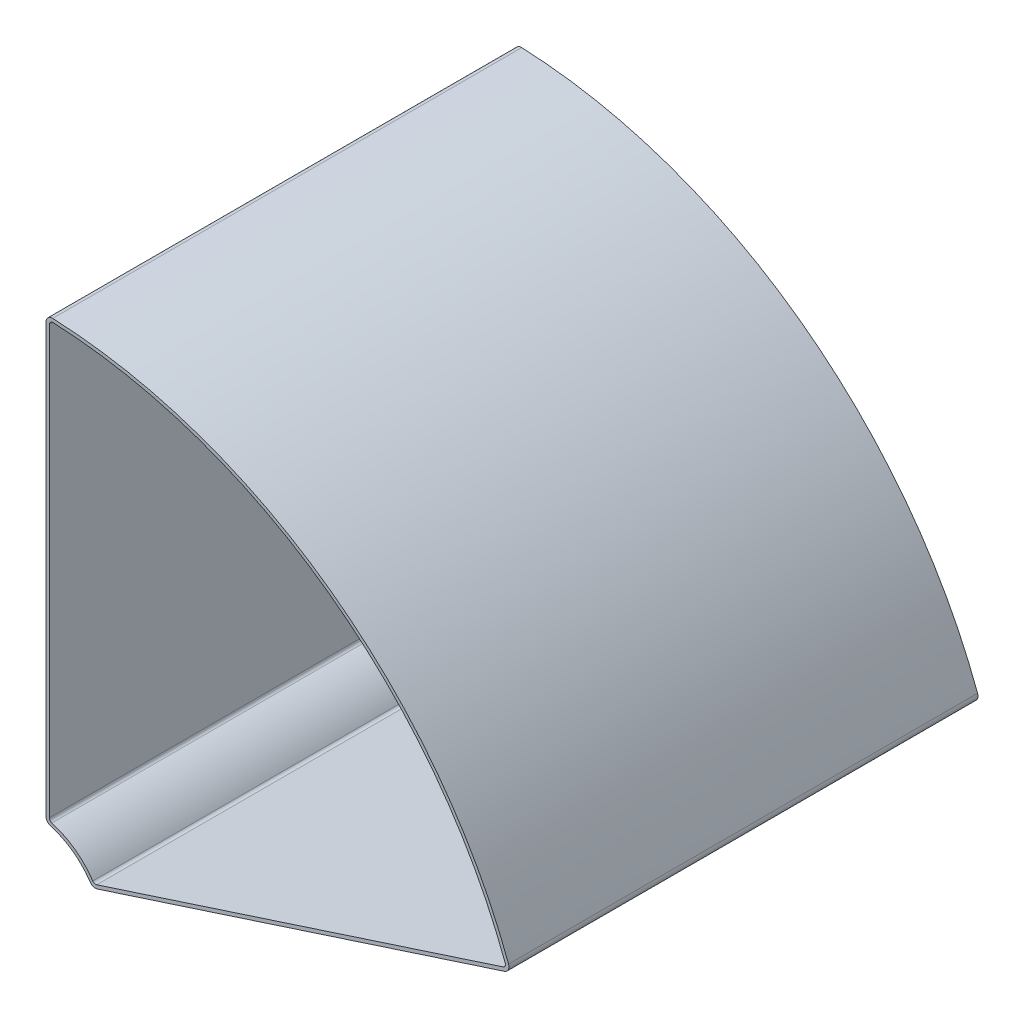
ISO-10303-21;
HEADER;
FILE_DESCRIPTION(('STEP AP214'),'2;1');
FILE_NAME('part.step','',(''),(''),'','','');
FILE_SCHEMA(('AUTOMOTIVE_DESIGN { 1 0 10303 214 1 1 1 1 }'));
ENDSEC;
DATA;
#1=APPLICATION_CONTEXT('core data for automotive mechanical design processes');
#2=APPLICATION_PROTOCOL_DEFINITION('international standard','automotive_design',2000,#1);
#3=PRODUCT_CONTEXT('',#1,'mechanical');
#4=PRODUCT('Part','Part','',(#3));
#5=PRODUCT_RELATED_PRODUCT_CATEGORY('part','',(#4));
#6=PRODUCT_DEFINITION_FORMATION('','',#4);
#7=PRODUCT_DEFINITION_CONTEXT('part definition',#1,'design');
#8=PRODUCT_DEFINITION('design','',#6,#7);
#9=PRODUCT_DEFINITION_SHAPE('','',#8);
#10=(LENGTH_UNIT() NAMED_UNIT(*) SI_UNIT(.MILLI.,.METRE.));
#11=(NAMED_UNIT(*) PLANE_ANGLE_UNIT() SI_UNIT($,.RADIAN.));
#12=(NAMED_UNIT(*) SI_UNIT($,.STERADIAN.) SOLID_ANGLE_UNIT());
#13=UNCERTAINTY_MEASURE_WITH_UNIT(LENGTH_MEASURE(1.E-05),#10,'distance_accuracy_value','');
#14=(GEOMETRIC_REPRESENTATION_CONTEXT(3) GLOBAL_UNCERTAINTY_ASSIGNED_CONTEXT((#13)) GLOBAL_UNIT_ASSIGNED_CONTEXT((#10,
#11,#12)) REPRESENTATION_CONTEXT('',''));
#15=CARTESIAN_POINT('',(0.,0.,0.));
#16=DIRECTION('',(0.,0.,1.));
#17=DIRECTION('',(1.,0.,0.));
#18=AXIS2_PLACEMENT_3D('',#15,#16,#17);
#19=CARTESIAN_POINT('',(-2.65754615162452,8.17908604013824,220.));
#20=DIRECTION('',(0.309016994374948,-0.951056516295153,0.));
#21=DIRECTION('',(0.951056516295154,0.309016994374948,0.));
#22=AXIS2_PLACEMENT_3D('',#19,#20,#21);
#23=PLANE('',#22);
#24=DIRECTION('',(-0.951056516295154,-0.309016994374948,0.));
#25=VECTOR('',#24,1.);
#26=CARTESIAN_POINT('',(-2.65754615162452,8.17908604013824,1.6));
#27=LINE('',#26,#25);
#28=CARTESIAN_POINT('',(221.391668918439,80.9770889419244,1.6));
#29=VERTEX_POINT('',#28);
#30=CARTESIAN_POINT('',(30.7720565747776,19.0410224031876,1.6));
#31=VERTEX_POINT('',#30);
#32=EDGE_CURVE('E563',#29,#31,#27,.T.);
#33=ORIENTED_EDGE('',*,*,#32,.T.);
#34=DIRECTION('',(0.,0.,1.));
#35=VECTOR('',#34,1.);
#36=CARTESIAN_POINT('',(30.7720565747776,19.0410224031876,220.));
#37=LINE('',#36,#35);
#38=CARTESIAN_POINT('',(30.7720565747776,19.0410224031876,220.));
#39=VERTEX_POINT('',#38);
#40=EDGE_CURVE('E159',#31,#39,#37,.T.);
#41=ORIENTED_EDGE('',*,*,#40,.T.);
#42=DIRECTION('',(-0.951056516295154,-0.309016994374948,0.));
#43=VECTOR('',#42,1.);
#44=CARTESIAN_POINT('',(-2.65754615162452,8.17908604013824,220.));
#45=LINE('',#44,#43);
#46=CARTESIAN_POINT('',(221.391668918439,80.9770889419244,220.));
#47=VERTEX_POINT('',#46);
#48=EDGE_CURVE('E201',#47,#39,#45,.T.);
#49=ORIENTED_EDGE('',*,*,#48,.F.);
#50=DIRECTION('',(0.,0.,-1.));
#51=VECTOR('',#50,1.);
#52=CARTESIAN_POINT('',(221.391668918439,80.9770889419244,220.));
#53=LINE('',#52,#51);
#54=EDGE_CURVE('E164',#47,#29,#53,.T.);
#55=ORIENTED_EDGE('',*,*,#54,.T.);
#56=EDGE_LOOP('',(#33,#41,#49,#55));
#57=FACE_BOUND('',#56,.T.);
#58=ADVANCED_FACE('F39',(#57),#23,.F.);
#59=CARTESIAN_POINT('',(0.,0.,220.));
#60=DIRECTION('',(0.,0.,-1.));
#61=DIRECTION('',(-1.,0.,0.));
#62=AXIS2_PLACEMENT_3D('',#59,#60,#61);
#63=CYLINDRICAL_SURFACE('',#62,35.);
#64=CARTESIAN_POINT('',(0.,0.,220.));
#65=DIRECTION('',(0.,0.,1.));
#66=DIRECTION('',(1.,0.,0.));
#67=AXIS2_PLACEMENT_3D('',#64,#65,#66);
#68=CIRCLE('',#67,35.);
#69=CARTESIAN_POINT('',(28.9540171702792,19.6637964214233,220.));
#70=VERTEX_POINT('',#69);
#71=CARTESIAN_POINT('',(9.75409836065576,33.6133539708648,220.));
#72=VERTEX_POINT('',#71);
#73=EDGE_CURVE('E174',#70,#72,#68,.T.);
#74=ORIENTED_EDGE('',*,*,#73,.F.);
#75=DIRECTION('',(0.,0.,-1.));
#76=VECTOR('',#75,1.);
#77=CARTESIAN_POINT('',(28.9540171702792,19.6637964214233,220.));
#78=LINE('',#77,#76);
#79=CARTESIAN_POINT('',(28.9540171702792,19.6637964214233,1.6));
#80=VERTEX_POINT('',#79);
#81=EDGE_CURVE('E158',#70,#80,#78,.T.);
#82=ORIENTED_EDGE('',*,*,#81,.T.);
#83=CARTESIAN_POINT('',(0.,0.,1.6));
#84=DIRECTION('',(0.,0.,1.));
#85=DIRECTION('',(1.,0.,0.));
#86=AXIS2_PLACEMENT_3D('',#83,#84,#85);
#87=CIRCLE('',#86,35.);
#88=CARTESIAN_POINT('',(9.75409836065576,33.6133539708648,1.6));
#89=VERTEX_POINT('',#88);
#90=EDGE_CURVE('E171',#80,#89,#87,.T.);
#91=ORIENTED_EDGE('',*,*,#90,.T.);
#92=DIRECTION('',(0.,0.,-1.));
#93=VECTOR('',#92,1.);
#94=CARTESIAN_POINT('',(9.75409836065576,33.6133539708648,220.));
#95=LINE('',#94,#93);
#96=EDGE_CURVE('E176',#89,#72,#95,.F.);
#97=ORIENTED_EDGE('',*,*,#96,.T.);
#98=EDGE_LOOP('',(#74,#82,#91,#97));
#99=FACE_BOUND('',#98,.T.);
#100=ADVANCED_FACE('F170',(#99),#63,.T.);
#101=CARTESIAN_POINT('',(8.60000000000003,0.,220.));
#102=DIRECTION('',(1.,0.,0.));
#103=DIRECTION('',(0.,1.,0.));
#104=AXIS2_PLACEMENT_3D('',#101,#102,#103);
#105=PLANE('',#104);
#106=DIRECTION('',(0.,-1.,0.));
#107=VECTOR('',#106,1.);
#108=CARTESIAN_POINT('',(8.60000000000003,0.,220.));
#109=LINE('',#108,#107);
#110=CARTESIAN_POINT('',(8.6,235.579286016407,220.));
#111=VERTEX_POINT('',#110);
#112=CARTESIAN_POINT('',(8.60000000000002,35.1499644381043,220.));
#113=VERTEX_POINT('',#112);
#114=EDGE_CURVE('E205',#111,#113,#109,.T.);
#115=ORIENTED_EDGE('',*,*,#114,.T.);
#116=DIRECTION('',(0.,0.,-1.));
#117=VECTOR('',#116,1.);
#118=CARTESIAN_POINT('',(8.60000000000002,35.1499644381043,220.));
#119=LINE('',#118,#117);
#120=CARTESIAN_POINT('',(8.60000000000002,35.1499644381043,1.6));
#121=VERTEX_POINT('',#120);
#122=EDGE_CURVE('E227',#113,#121,#119,.T.);
#123=ORIENTED_EDGE('',*,*,#122,.T.);
#124=DIRECTION('',(0.,-1.,0.));
#125=VECTOR('',#124,1.);
#126=CARTESIAN_POINT('',(8.60000000000003,0.,1.6));
#127=LINE('',#126,#125);
#128=CARTESIAN_POINT('',(8.6,235.579286016407,1.6));
#129=VERTEX_POINT('',#128);
#130=EDGE_CURVE('E181',#129,#121,#127,.T.);
#131=ORIENTED_EDGE('',*,*,#130,.F.);
#132=DIRECTION('',(0.,0.,1.));
#133=VECTOR('',#132,1.);
#134=CARTESIAN_POINT('',(8.6,235.579286016407,220.));
#135=LINE('',#134,#133);
#136=EDGE_CURVE('E225',#129,#111,#135,.T.);
#137=ORIENTED_EDGE('',*,*,#136,.T.);
#138=EDGE_LOOP('',(#115,#123,#131,#137));
#139=FACE_BOUND('',#138,.T.);
#140=ADVANCED_FACE('F318',(#139),#105,.T.);
#141=CARTESIAN_POINT('',(0.,0.,220.));
#142=DIRECTION('',(0.,0.,-1.));
#143=DIRECTION('',(-1.,0.,0.));
#144=AXIS2_PLACEMENT_3D('',#141,#142,#143);
#145=CYLINDRICAL_SURFACE('',#144,33.4);
#146=CARTESIAN_POINT('',(0.,0.,0.));
#147=DIRECTION('',(0.,0.,1.));
#148=DIRECTION('',(1.,0.,0.));
#149=AXIS2_PLACEMENT_3D('',#146,#147,#148);
#150=CIRCLE('',#149,33.4);
#151=CARTESIAN_POINT('',(27.707561529854,18.6507649727661,0.));
#152=VERTEX_POINT('',#151);
#153=CARTESIAN_POINT('',(9.17582417582418,32.1148602782942,0.));
#154=VERTEX_POINT('',#153);
#155=EDGE_CURVE('E180',#152,#154,#150,.T.);
#156=ORIENTED_EDGE('',*,*,#155,.F.);
#157=DIRECTION('',(0.,0.,-1.));
#158=VECTOR('',#157,1.);
#159=CARTESIAN_POINT('',(27.707561529854,18.6507649727661,220.));
#160=LINE('',#159,#158);
#161=CARTESIAN_POINT('',(27.707561529854,18.6507649727661,220.));
#162=VERTEX_POINT('',#161);
#163=EDGE_CURVE('E259',#152,#162,#160,.F.);
#164=ORIENTED_EDGE('',*,*,#163,.T.);
#165=CARTESIAN_POINT('',(0.,0.,220.));
#166=DIRECTION('',(0.,0.,1.));
#167=DIRECTION('',(1.,0.,0.));
#168=AXIS2_PLACEMENT_3D('',#165,#166,#167);
#169=CIRCLE('',#168,33.4);
#170=CARTESIAN_POINT('',(9.17582417582418,32.1148602782942,220.));
#171=VERTEX_POINT('',#170);
#172=EDGE_CURVE('E190',#162,#171,#169,.T.);
#173=ORIENTED_EDGE('',*,*,#172,.T.);
#174=DIRECTION('',(0.,0.,-1.));
#175=VECTOR('',#174,1.);
#176=CARTESIAN_POINT('',(9.17582417582418,32.1148602782942,220.));
#177=LINE('',#176,#175);
#178=EDGE_CURVE('E256',#171,#154,#177,.T.);
#179=ORIENTED_EDGE('',*,*,#178,.T.);
#180=EDGE_LOOP('',(#156,#164,#173,#179));
#181=FACE_BOUND('',#180,.T.);
#182=ADVANCED_FACE('F294',(#181),#145,.F.);
#183=CARTESIAN_POINT('',(-2.16311896062463,6.65739561406607,220.));
#184=DIRECTION('',(0.309016994374948,-0.951056516295154,0.));
#185=DIRECTION('',(0.951056516295154,0.309016994374948,0.));
#186=AXIS2_PLACEMENT_3D('',#183,#184,#185);
#187=PLANE('',#186);
#188=DIRECTION('',(-0.951056516295154,-0.309016994374948,0.));
#189=VECTOR('',#188,1.);
#190=CARTESIAN_POINT('',(-2.16311896062463,6.65739561406607,220.));
#191=LINE('',#190,#189);
#192=CARTESIAN_POINT('',(222.084633334989,79.5199071708688,220.));
#193=VERTEX_POINT('',#192);
#194=CARTESIAN_POINT('',(31.1233156444028,17.4728138346081,220.));
#195=VERTEX_POINT('',#194);
#196=EDGE_CURVE('E193',#193,#195,#191,.T.);
#197=ORIENTED_EDGE('',*,*,#196,.T.);
#198=DIRECTION('',(0.,0.,-1.));
#199=VECTOR('',#198,1.);
#200=CARTESIAN_POINT('',(31.1233156444028,17.4728138346081,220.));
#201=LINE('',#200,#199);
#202=CARTESIAN_POINT('',(31.1233156444028,17.4728138346081,0.));
#203=VERTEX_POINT('',#202);
#204=EDGE_CURVE('E245',#195,#203,#201,.T.);
#205=ORIENTED_EDGE('',*,*,#204,.T.);
#206=DIRECTION('',(-0.951056516295154,-0.309016994374948,0.));
#207=VECTOR('',#206,1.);
#208=CARTESIAN_POINT('',(-2.16311896062463,6.65739561406607,0.));
#209=LINE('',#208,#207);
#210=CARTESIAN_POINT('',(222.084633334989,79.5199071708688,0.));
#211=VERTEX_POINT('',#210);
#212=EDGE_CURVE('E184',#211,#203,#209,.T.);
#213=ORIENTED_EDGE('',*,*,#212,.F.);
#214=DIRECTION('',(0.,0.,1.));
#215=VECTOR('',#214,1.);
#216=CARTESIAN_POINT('',(222.084633334989,79.5199071708688,220.));
#217=LINE('',#216,#215);
#218=EDGE_CURVE('E243',#211,#193,#217,.T.);
#219=ORIENTED_EDGE('',*,*,#218,.T.);
#220=EDGE_LOOP('',(#197,#205,#213,#219));
#221=FACE_BOUND('',#220,.T.);
#222=ADVANCED_FACE('F302',(#221),#187,.T.);
#223=CARTESIAN_POINT('',(0.,0.,220.));
#224=DIRECTION('',(0.,0.,-1.));
#225=DIRECTION('',(-1.,0.,0.));
#226=AXIS2_PLACEMENT_3D('',#223,#224,#225);
#227=CYLINDRICAL_SURFACE('',#226,239.);
#228=CARTESIAN_POINT('',(0.,0.,220.));
#229=DIRECTION('',(0.,0.,1.));
#230=DIRECTION('',(1.,0.,0.));
#231=AXIS2_PLACEMENT_3D('',#228,#229,#230);
#232=CIRCLE('',#231,239.);
#233=CARTESIAN_POINT('',(223.968907551252,83.420192101785,220.));
#234=VERTEX_POINT('',#233);
#235=CARTESIAN_POINT('',(10.1271186440678,238.785346007599,220.));
#236=VERTEX_POINT('',#235);
#237=EDGE_CURVE('E197',#234,#236,#232,.T.);
#238=ORIENTED_EDGE('',*,*,#237,.F.);
#239=DIRECTION('',(0.,0.,-1.));
#240=VECTOR('',#239,1.);
#241=CARTESIAN_POINT('',(223.968907551252,83.4201921017851,220.));
#242=LINE('',#241,#240);
#243=CARTESIAN_POINT('',(223.968907551252,83.420192101785,0.));
#244=VERTEX_POINT('',#243);
#245=EDGE_CURVE('E11',#234,#244,#242,.T.);
#246=ORIENTED_EDGE('',*,*,#245,.T.);
#247=CARTESIAN_POINT('',(0.,0.,0.));
#248=DIRECTION('',(0.,0.,1.));
#249=DIRECTION('',(1.,0.,0.));
#250=AXIS2_PLACEMENT_3D('',#247,#248,#249);
#251=CIRCLE('',#250,239.);
#252=CARTESIAN_POINT('',(10.1271186440678,238.785346007599,0.));
#253=VERTEX_POINT('',#252);
#254=EDGE_CURVE('E213',#244,#253,#251,.T.);
#255=ORIENTED_EDGE('',*,*,#254,.T.);
#256=DIRECTION('',(0.,0.,-1.));
#257=VECTOR('',#256,1.);
#258=CARTESIAN_POINT('',(10.1271186440678,238.785346007599,220.));
#259=LINE('',#258,#257);
#260=EDGE_CURVE('E47',#253,#236,#259,.F.);
#261=ORIENTED_EDGE('',*,*,#260,.T.);
#262=EDGE_LOOP('',(#238,#246,#255,#261));
#263=FACE_BOUND('',#262,.T.);
#264=ADVANCED_FACE('F274',(#263),#227,.T.);
#265=CARTESIAN_POINT('',(7.,0.,220.));
#266=DIRECTION('',(1.,0.,0.));
#267=DIRECTION('',(0.,0.,-1.));
#268=AXIS2_PLACEMENT_3D('',#265,#266,#267);
#269=PLANE('',#268);
#270=DIRECTION('',(0.,-1.,0.));
#271=VECTOR('',#270,1.);
#272=CARTESIAN_POINT('',(7.,0.,0.));
#273=LINE('',#272,#271);
#274=CARTESIAN_POINT('',(7.,235.788040409178,0.));
#275=VERTEX_POINT('',#274);
#276=CARTESIAN_POINT('',(7.,34.9994285667638,0.));
#277=VERTEX_POINT('',#276);
#278=EDGE_CURVE('E194',#275,#277,#273,.T.);
#279=ORIENTED_EDGE('',*,*,#278,.T.);
#280=DIRECTION('',(0.,0.,1.));
#281=VECTOR('',#280,1.);
#282=CARTESIAN_POINT('',(7.,34.9994285667638,220.));
#283=LINE('',#282,#281);
#284=CARTESIAN_POINT('',(7.,34.9994285667638,220.));
#285=VERTEX_POINT('',#284);
#286=EDGE_CURVE('E54',#277,#285,#283,.T.);
#287=ORIENTED_EDGE('',*,*,#286,.T.);
#288=DIRECTION('',(0.,-1.,0.));
#289=VECTOR('',#288,1.);
#290=CARTESIAN_POINT('',(7.,0.,220.));
#291=LINE('',#290,#289);
#292=CARTESIAN_POINT('',(7.,235.788040409178,220.));
#293=VERTEX_POINT('',#292);
#294=EDGE_CURVE('E199',#293,#285,#291,.T.);
#295=ORIENTED_EDGE('',*,*,#294,.F.);
#296=DIRECTION('',(0.,0.,-1.));
#297=VECTOR('',#296,1.);
#298=CARTESIAN_POINT('',(7.,235.788040409178,220.));
#299=LINE('',#298,#297);
#300=EDGE_CURVE('E268',#293,#275,#299,.T.);
#301=ORIENTED_EDGE('',*,*,#300,.T.);
#302=EDGE_LOOP('',(#279,#287,#295,#301));
#303=FACE_BOUND('',#302,.T.);
#304=ADVANCED_FACE('F285',(#303),#269,.F.);
#305=CARTESIAN_POINT('',(0.,0.,220.));
#306=DIRECTION('',(0.,0.,-1.));
#307=DIRECTION('',(-1.,0.,0.));
#308=AXIS2_PLACEMENT_3D('',#305,#306,#307);
#309=CYLINDRICAL_SURFACE('',#308,237.4);
#310=CARTESIAN_POINT('',(0.,0.,220.));
#311=DIRECTION('',(0.,0.,1.));
#312=DIRECTION('',(1.,0.,0.));
#313=AXIS2_PLACEMENT_3D('',#310,#311,#312);
#314=CIRCLE('',#313,237.4);
#315=CARTESIAN_POINT('',(222.396120382078,83.0585675231654,220.));
#316=VERTEX_POINT('',#315);
#317=CARTESIAN_POINT('',(10.2692111959288,237.177788381234,220.));
#318=VERTEX_POINT('',#317);
#319=EDGE_CURVE('E208',#316,#318,#314,.T.);
#320=ORIENTED_EDGE('',*,*,#319,.T.);
#321=DIRECTION('',(0.,0.,-1.));
#322=VECTOR('',#321,1.);
#323=CARTESIAN_POINT('',(10.2692111959288,237.177788381234,220.));
#324=LINE('',#323,#322);
#325=CARTESIAN_POINT('',(10.2692111959288,237.177788381234,1.6));
#326=VERTEX_POINT('',#325);
#327=EDGE_CURVE('E232',#318,#326,#324,.T.);
#328=ORIENTED_EDGE('',*,*,#327,.T.);
#329=CARTESIAN_POINT('',(0.,0.,1.6));
#330=DIRECTION('',(0.,0.,1.));
#331=DIRECTION('',(1.,0.,0.));
#332=AXIS2_PLACEMENT_3D('',#329,#330,#331);
#333=CIRCLE('',#332,237.4);
#334=CARTESIAN_POINT('',(222.396120382078,83.0585675231654,1.6));
#335=VERTEX_POINT('',#334);
#336=EDGE_CURVE('E186',#335,#326,#333,.T.);
#337=ORIENTED_EDGE('',*,*,#336,.F.);
#338=DIRECTION('',(0.,0.,-1.));
#339=VECTOR('',#338,1.);
#340=CARTESIAN_POINT('',(222.396120382078,83.0585675231654,220.));
#341=LINE('',#340,#339);
#342=EDGE_CURVE('E230',#335,#316,#341,.F.);
#343=ORIENTED_EDGE('',*,*,#342,.T.);
#344=EDGE_LOOP('',(#320,#328,#337,#343));
#345=FACE_BOUND('',#344,.T.);
#346=ADVANCED_FACE('F324',(#345),#309,.F.);
#347=CARTESIAN_POINT('',(0.,0.,220.));
#348=DIRECTION('',(0.,0.,1.));
#349=DIRECTION('',(1.,0.,0.));
#350=AXIS2_PLACEMENT_3D('',#347,#348,#349);
#351=PLANE('',#350);
#352=ORIENTED_EDGE('',*,*,#172,.F.);
#353=CARTESIAN_POINT('',(30.196264661278,20.3259833834935,220.));
#354=DIRECTION('',(0.,0.,1.));
#355=DIRECTION('',(1.,0.,0.));
#356=AXIS2_PLACEMENT_3D('',#353,#354,#355);
#357=CIRCLE('',#356,3.);
#358=EDGE_CURVE('E266',#162,#195,#357,.T.);
#359=ORIENTED_EDGE('',*,*,#358,.T.);
#360=ORIENTED_EDGE('',*,*,#196,.F.);
#361=CARTESIAN_POINT('',(221.157582351864,82.3730767197543,220.));
#362=DIRECTION('',(0.,0.,1.));
#363=DIRECTION('',(1.,0.,0.));
#364=AXIS2_PLACEMENT_3D('',#361,#362,#363);
#365=CIRCLE('',#364,3.);
#366=EDGE_CURVE('E262',#193,#234,#365,.T.);
#367=ORIENTED_EDGE('',*,*,#366,.T.);
#368=ORIENTED_EDGE('',*,*,#237,.T.);
#369=CARTESIAN_POINT('',(10.,235.788040409178,220.));
#370=DIRECTION('',(0.,0.,1.));
#371=DIRECTION('',(1.,0.,0.));
#372=AXIS2_PLACEMENT_3D('',#369,#370,#371);
#373=CIRCLE('',#372,3.);
#374=EDGE_CURVE('E61',#236,#293,#373,.T.);
#375=ORIENTED_EDGE('',*,*,#374,.T.);
#376=ORIENTED_EDGE('',*,*,#294,.T.);
#377=CARTESIAN_POINT('',(10.,34.9994285667638,220.));
#378=DIRECTION('',(0.,0.,1.));
#379=DIRECTION('',(1.,0.,0.));
#380=AXIS2_PLACEMENT_3D('',#377,#378,#379);
#381=CIRCLE('',#380,3.);
#382=EDGE_CURVE('E264',#285,#171,#381,.T.);
#383=ORIENTED_EDGE('',*,*,#382,.T.);
#384=EDGE_LOOP('',(#352,#359,#360,#367,#368,#375,#376,#383));
#385=FACE_BOUND('',#384,.T.);
#386=ORIENTED_EDGE('',*,*,#319,.F.);
#387=CARTESIAN_POINT('',(220.897241727439,82.4987793679967,220.));
#388=DIRECTION('',(0.,0.,1.));
#389=DIRECTION('',(1.,0.,0.));
#390=AXIS2_PLACEMENT_3D('',#387,#388,#389);
#391=CIRCLE('',#390,1.6);
#392=EDGE_CURVE('E241',#316,#47,#391,.F.);
#393=ORIENTED_EDGE('',*,*,#392,.T.);
#394=ORIENTED_EDGE('',*,*,#48,.T.);
#395=CARTESIAN_POINT('',(30.2776293837776,20.5627128292598,220.));
#396=DIRECTION('',(0.,0.,1.));
#397=DIRECTION('',(1.,0.,0.));
#398=AXIS2_PLACEMENT_3D('',#395,#396,#397);
#399=CIRCLE('',#398,1.6);
#400=EDGE_CURVE('E235',#39,#70,#399,.F.);
#401=ORIENTED_EDGE('',*,*,#400,.T.);
#402=ORIENTED_EDGE('',*,*,#73,.T.);
#403=CARTESIAN_POINT('',(10.2,35.1499644381043,220.));
#404=DIRECTION('',(0.,0.,1.));
#405=DIRECTION('',(1.,0.,0.));
#406=AXIS2_PLACEMENT_3D('',#403,#404,#405);
#407=CIRCLE('',#406,1.6);
#408=EDGE_CURVE('E237',#72,#113,#407,.F.);
#409=ORIENTED_EDGE('',*,*,#408,.T.);
#410=ORIENTED_EDGE('',*,*,#114,.F.);
#411=CARTESIAN_POINT('',(10.2,235.579286016407,220.));
#412=DIRECTION('',(0.,0.,1.));
#413=DIRECTION('',(1.,0.,0.));
#414=AXIS2_PLACEMENT_3D('',#411,#412,#413);
#415=CIRCLE('',#414,1.6);
#416=EDGE_CURVE('E239',#111,#318,#415,.F.);
#417=ORIENTED_EDGE('',*,*,#416,.T.);
#418=EDGE_LOOP('',(#386,#393,#394,#401,#402,#409,#410,#417));
#419=FACE_BOUND('',#418,.T.);
#420=ADVANCED_FACE('F279',(#385,#419),#351,.T.);
#421=CARTESIAN_POINT('',(0.,0.,0.));
#422=DIRECTION('',(0.,0.,1.));
#423=DIRECTION('',(1.,0.,0.));
#424=AXIS2_PLACEMENT_3D('',#421,#422,#423);
#425=PLANE('',#424);
#426=ORIENTED_EDGE('',*,*,#212,.T.);
#427=CARTESIAN_POINT('',(30.196264661278,20.3259833834935,0.));
#428=DIRECTION('',(0.,0.,1.));
#429=DIRECTION('',(1.,0.,0.));
#430=AXIS2_PLACEMENT_3D('',#427,#428,#429);
#431=CIRCLE('',#430,3.);
#432=EDGE_CURVE('E254',#203,#152,#431,.F.);
#433=ORIENTED_EDGE('',*,*,#432,.T.);
#434=ORIENTED_EDGE('',*,*,#155,.T.);
#435=CARTESIAN_POINT('',(10.,34.9994285667638,0.));
#436=DIRECTION('',(0.,0.,1.));
#437=DIRECTION('',(1.,0.,0.));
#438=AXIS2_PLACEMENT_3D('',#435,#436,#437);
#439=CIRCLE('',#438,3.);
#440=EDGE_CURVE('E252',#154,#277,#439,.F.);
#441=ORIENTED_EDGE('',*,*,#440,.T.);
#442=ORIENTED_EDGE('',*,*,#278,.F.);
#443=CARTESIAN_POINT('',(10.,235.788040409178,0.));
#444=DIRECTION('',(0.,0.,1.));
#445=DIRECTION('',(1.,0.,0.));
#446=AXIS2_PLACEMENT_3D('',#443,#444,#445);
#447=CIRCLE('',#446,3.);
#448=EDGE_CURVE('E248',#275,#253,#447,.F.);
#449=ORIENTED_EDGE('',*,*,#448,.T.);
#450=ORIENTED_EDGE('',*,*,#254,.F.);
#451=CARTESIAN_POINT('',(221.157582351864,82.3730767197543,0.));
#452=DIRECTION('',(0.,0.,1.));
#453=DIRECTION('',(1.,0.,0.));
#454=AXIS2_PLACEMENT_3D('',#451,#452,#453);
#455=CIRCLE('',#454,3.);
#456=EDGE_CURVE('E250',#244,#211,#455,.F.);
#457=ORIENTED_EDGE('',*,*,#456,.T.);
#458=EDGE_LOOP('',(#426,#433,#434,#441,#442,#449,#450,#457));
#459=FACE_BOUND('',#458,.T.);
#460=ADVANCED_FACE('F287',(#459),#425,.F.);
#461=CARTESIAN_POINT('',(0.,0.,1.6));
#462=DIRECTION('',(0.,0.,1.));
#463=DIRECTION('',(1.,0.,0.));
#464=AXIS2_PLACEMENT_3D('',#461,#462,#463);
#465=PLANE('',#464);
#466=ORIENTED_EDGE('',*,*,#90,.F.);
#467=CARTESIAN_POINT('',(30.2776293837776,20.5627128292598,1.59999999999999));
#468=DIRECTION('',(0.,0.,1.));
#469=DIRECTION('',(1.,0.,0.));
#470=AXIS2_PLACEMENT_3D('',#467,#468,#469);
#471=CIRCLE('',#470,1.6);
#472=EDGE_CURVE('E154',#80,#31,#471,.T.);
#473=ORIENTED_EDGE('',*,*,#472,.T.);
#474=ORIENTED_EDGE('',*,*,#32,.F.);
#475=CARTESIAN_POINT('',(220.897241727439,82.4987793679967,1.59999999999999));
#476=DIRECTION('',(0.,0.,1.));
#477=DIRECTION('',(1.,0.,0.));
#478=AXIS2_PLACEMENT_3D('',#475,#476,#477);
#479=CIRCLE('',#478,1.6);
#480=EDGE_CURVE('E175',#29,#335,#479,.T.);
#481=ORIENTED_EDGE('',*,*,#480,.T.);
#482=ORIENTED_EDGE('',*,*,#336,.T.);
#483=CARTESIAN_POINT('',(10.2,235.579286016407,1.59999999999999));
#484=DIRECTION('',(0.,0.,1.));
#485=DIRECTION('',(1.,0.,0.));
#486=AXIS2_PLACEMENT_3D('',#483,#484,#485);
#487=CIRCLE('',#486,1.6);
#488=EDGE_CURVE('E219',#326,#129,#487,.T.);
#489=ORIENTED_EDGE('',*,*,#488,.T.);
#490=ORIENTED_EDGE('',*,*,#130,.T.);
#491=CARTESIAN_POINT('',(10.2,35.1499644381043,1.59999999999999));
#492=DIRECTION('',(0.,0.,1.));
#493=DIRECTION('',(1.,0.,0.));
#494=AXIS2_PLACEMENT_3D('',#491,#492,#493);
#495=CIRCLE('',#494,1.6);
#496=EDGE_CURVE('E165',#121,#89,#495,.T.);
#497=ORIENTED_EDGE('',*,*,#496,.T.);
#498=EDGE_LOOP('',(#466,#473,#474,#481,#482,#489,#490,#497));
#499=FACE_BOUND('',#498,.T.);
#500=ADVANCED_FACE('F178',(#499),#465,.T.);
#501=CARTESIAN_POINT('',(30.2776293837776,20.5627128292598,220.));
#502=DIRECTION('',(0.,0.,-1.));
#503=DIRECTION('',(-1.,0.,0.));
#504=AXIS2_PLACEMENT_3D('',#501,#502,#503);
#505=CYLINDRICAL_SURFACE('',#504,1.6);
#506=ORIENTED_EDGE('',*,*,#400,.F.);
#507=ORIENTED_EDGE('',*,*,#40,.F.);
#508=ORIENTED_EDGE('',*,*,#472,.F.);
#509=ORIENTED_EDGE('',*,*,#81,.F.);
#510=EDGE_LOOP('',(#506,#507,#508,#509));
#511=FACE_BOUND('',#510,.T.);
#512=ADVANCED_FACE('F157',(#511),#505,.F.);
#513=CARTESIAN_POINT('',(10.2,35.1499644381043,220.));
#514=DIRECTION('',(0.,0.,-1.));
#515=DIRECTION('',(-1.,0.,0.));
#516=AXIS2_PLACEMENT_3D('',#513,#514,#515);
#517=CYLINDRICAL_SURFACE('',#516,1.6);
#518=ORIENTED_EDGE('',*,*,#408,.F.);
#519=ORIENTED_EDGE('',*,*,#96,.F.);
#520=ORIENTED_EDGE('',*,*,#496,.F.);
#521=ORIENTED_EDGE('',*,*,#122,.F.);
#522=EDGE_LOOP('',(#518,#519,#520,#521));
#523=FACE_BOUND('',#522,.T.);
#524=ADVANCED_FACE('F333',(#523),#517,.F.);
#525=CARTESIAN_POINT('',(10.2,235.579286016407,220.));
#526=DIRECTION('',(0.,0.,-1.));
#527=DIRECTION('',(-1.,0.,0.));
#528=AXIS2_PLACEMENT_3D('',#525,#526,#527);
#529=CYLINDRICAL_SURFACE('',#528,1.6);
#530=ORIENTED_EDGE('',*,*,#416,.F.);
#531=ORIENTED_EDGE('',*,*,#136,.F.);
#532=ORIENTED_EDGE('',*,*,#488,.F.);
#533=ORIENTED_EDGE('',*,*,#327,.F.);
#534=EDGE_LOOP('',(#530,#531,#532,#533));
#535=FACE_BOUND('',#534,.T.);
#536=ADVANCED_FACE('F336',(#535),#529,.F.);
#537=CARTESIAN_POINT('',(220.897241727439,82.4987793679967,220.));
#538=DIRECTION('',(0.,0.,-1.));
#539=DIRECTION('',(-1.,0.,0.));
#540=AXIS2_PLACEMENT_3D('',#537,#538,#539);
#541=CYLINDRICAL_SURFACE('',#540,1.6);
#542=ORIENTED_EDGE('',*,*,#392,.F.);
#543=ORIENTED_EDGE('',*,*,#342,.F.);
#544=ORIENTED_EDGE('',*,*,#480,.F.);
#545=ORIENTED_EDGE('',*,*,#54,.F.);
#546=EDGE_LOOP('',(#542,#543,#544,#545));
#547=FACE_BOUND('',#546,.T.);
#548=ADVANCED_FACE('F340',(#547),#541,.F.);
#549=CARTESIAN_POINT('',(30.196264661278,20.3259833834935,220.));
#550=DIRECTION('',(0.,0.,-1.));
#551=DIRECTION('',(-1.,0.,0.));
#552=AXIS2_PLACEMENT_3D('',#549,#550,#551);
#553=CYLINDRICAL_SURFACE('',#552,3.);
#554=ORIENTED_EDGE('',*,*,#358,.F.);
#555=ORIENTED_EDGE('',*,*,#163,.F.);
#556=ORIENTED_EDGE('',*,*,#432,.F.);
#557=ORIENTED_EDGE('',*,*,#204,.F.);
#558=EDGE_LOOP('',(#554,#555,#556,#557));
#559=FACE_BOUND('',#558,.T.);
#560=ADVANCED_FACE('F299',(#559),#553,.T.);
#561=CARTESIAN_POINT('',(10.,34.9994285667638,220.));
#562=DIRECTION('',(0.,0.,-1.));
#563=DIRECTION('',(-1.,0.,0.));
#564=AXIS2_PLACEMENT_3D('',#561,#562,#563);
#565=CYLINDRICAL_SURFACE('',#564,3.);
#566=ORIENTED_EDGE('',*,*,#382,.F.);
#567=ORIENTED_EDGE('',*,*,#286,.F.);
#568=ORIENTED_EDGE('',*,*,#440,.F.);
#569=ORIENTED_EDGE('',*,*,#178,.F.);
#570=EDGE_LOOP('',(#566,#567,#568,#569));
#571=FACE_BOUND('',#570,.T.);
#572=ADVANCED_FACE('F292',(#571),#565,.T.);
#573=CARTESIAN_POINT('',(221.157582351864,82.3730767197543,220.));
#574=DIRECTION('',(0.,0.,-1.));
#575=DIRECTION('',(-1.,0.,0.));
#576=AXIS2_PLACEMENT_3D('',#573,#574,#575);
#577=CYLINDRICAL_SURFACE('',#576,3.);
#578=ORIENTED_EDGE('',*,*,#366,.F.);
#579=ORIENTED_EDGE('',*,*,#218,.F.);
#580=ORIENTED_EDGE('',*,*,#456,.F.);
#581=ORIENTED_EDGE('',*,*,#245,.F.);
#582=EDGE_LOOP('',(#578,#579,#580,#581));
#583=FACE_BOUND('',#582,.T.);
#584=ADVANCED_FACE('F305',(#583),#577,.T.);
#585=CARTESIAN_POINT('',(10.,235.788040409178,220.));
#586=DIRECTION('',(0.,0.,-1.));
#587=DIRECTION('',(-1.,0.,0.));
#588=AXIS2_PLACEMENT_3D('',#585,#586,#587);
#589=CYLINDRICAL_SURFACE('',#588,3.);
#590=ORIENTED_EDGE('',*,*,#374,.F.);
#591=ORIENTED_EDGE('',*,*,#260,.F.);
#592=ORIENTED_EDGE('',*,*,#448,.F.);
#593=ORIENTED_EDGE('',*,*,#300,.F.);
#594=EDGE_LOOP('',(#590,#591,#592,#593));
#595=FACE_BOUND('',#594,.T.);
#596=ADVANCED_FACE('F41',(#595),#589,.T.);
#597=CLOSED_SHELL('',(#58,#100,#140,#182,#222,#264,#304,#346,#420,#460,#500,#512,#524,#536,#548,
#560,#572,#584,#596));
#598=MANIFOLD_SOLID_BREP('B2',#597);
#599=ADVANCED_BREP_SHAPE_REPRESENTATION('',(#18,#598),#14);
#600=SHAPE_DEFINITION_REPRESENTATION(#9,#599);
ENDSEC;
END-ISO-10303-21;
